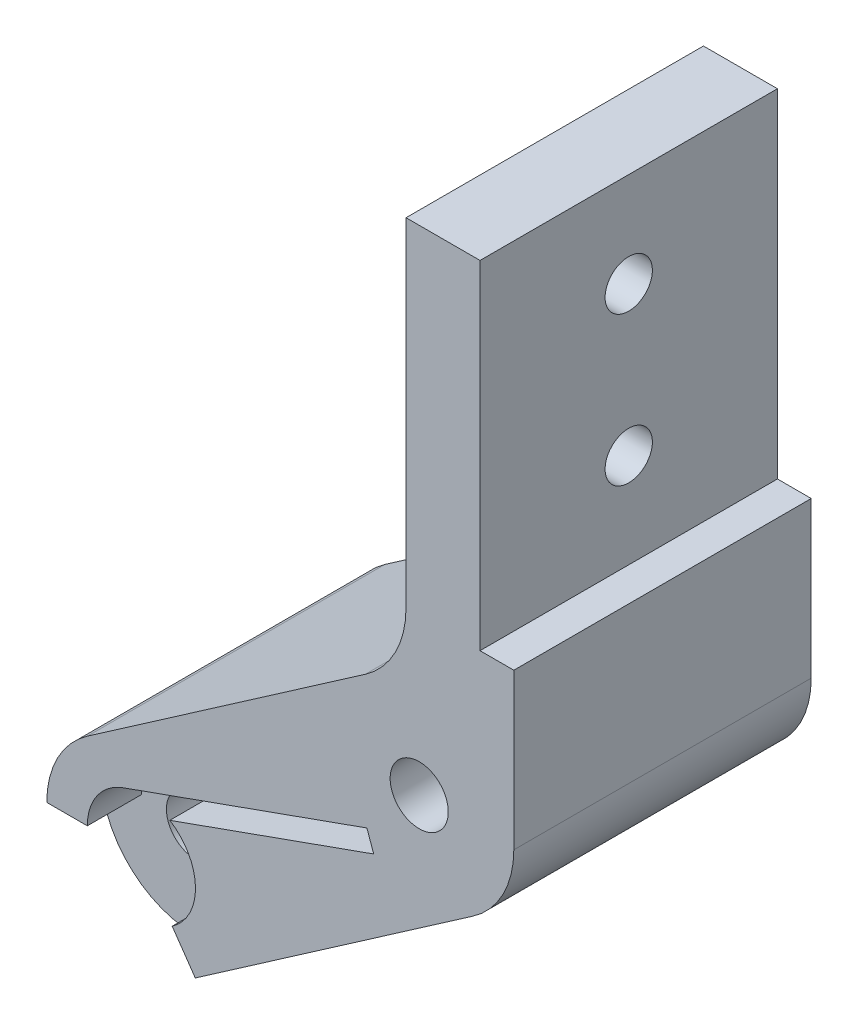
ISO-10303-21;
HEADER;
FILE_DESCRIPTION(('STEP AP214'),'2;1');
FILE_NAME('part.step','',(''),(''),'','','');
FILE_SCHEMA(('AUTOMOTIVE_DESIGN { 1 0 10303 214 1 1 1 1 }'));
ENDSEC;
DATA;
#1=APPLICATION_CONTEXT('core data for automotive mechanical design processes');
#2=APPLICATION_PROTOCOL_DEFINITION('international standard','automotive_design',2000,#1);
#3=PRODUCT_CONTEXT('',#1,'mechanical');
#4=PRODUCT('Part','Part','',(#3));
#5=PRODUCT_RELATED_PRODUCT_CATEGORY('part','',(#4));
#6=PRODUCT_DEFINITION_FORMATION('','',#4);
#7=PRODUCT_DEFINITION_CONTEXT('part definition',#1,'design');
#8=PRODUCT_DEFINITION('design','',#6,#7);
#9=PRODUCT_DEFINITION_SHAPE('','',#8);
#10=(LENGTH_UNIT() NAMED_UNIT(*) SI_UNIT(.MILLI.,.METRE.));
#11=(NAMED_UNIT(*) PLANE_ANGLE_UNIT() SI_UNIT($,.RADIAN.));
#12=(NAMED_UNIT(*) SI_UNIT($,.STERADIAN.) SOLID_ANGLE_UNIT());
#13=UNCERTAINTY_MEASURE_WITH_UNIT(LENGTH_MEASURE(1.E-05),#10,'distance_accuracy_value','');
#14=(GEOMETRIC_REPRESENTATION_CONTEXT(3) GLOBAL_UNCERTAINTY_ASSIGNED_CONTEXT((#13)) GLOBAL_UNIT_ASSIGNED_CONTEXT((#10,
#11,#12)) REPRESENTATION_CONTEXT('',''));
#15=CARTESIAN_POINT('',(0.,0.,0.));
#16=DIRECTION('',(0.,0.,1.));
#17=DIRECTION('',(1.,0.,0.));
#18=AXIS2_PLACEMENT_3D('',#15,#16,#17);
#19=CARTESIAN_POINT('',(11.878198097342,-9.51961429424794,9.00000000000001));
#20=DIRECTION('',(-0.941780242902148,-0.336229050022706,0.));
#21=DIRECTION('',(0.336229050022706,-0.941780242902148,0.));
#22=AXIS2_PLACEMENT_3D('',#19,#20,#21);
#23=PLANE('',#22);
#24=DIRECTION('',(-0.336229050022698,0.941780242902151,0.));
#25=VECTOR('',#24,1.);
#26=CARTESIAN_POINT('',(11.878198097342,-9.51961429424794,9.00000000000001));
#27=LINE('',#26,#25);
#28=CARTESIAN_POINT('',(11.878198097342,-9.51961429424794,9.00000000000001));
#29=VERTEX_POINT('',#28);
#30=CARTESIAN_POINT('',(11.3738545223079,-8.10694392989472,9.00000000000001));
#31=VERTEX_POINT('',#30);
#32=EDGE_CURVE('E273',#29,#31,#27,.T.);
#33=ORIENTED_EDGE('',*,*,#32,.F.);
#34=DIRECTION('',(0.,0.,1.));
#35=VECTOR('',#34,1.);
#36=CARTESIAN_POINT('',(11.878198097342,-9.51961429424794,7.));
#37=LINE('',#36,#35);
#38=CARTESIAN_POINT('',(11.878198097342,-9.51961429424794,11.));
#39=VERTEX_POINT('',#38);
#40=EDGE_CURVE('E263',#29,#39,#37,.T.);
#41=ORIENTED_EDGE('',*,*,#40,.T.);
#42=DIRECTION('',(0.336229050022706,-0.941780242902148,0.));
#43=VECTOR('',#42,1.);
#44=CARTESIAN_POINT('',(11.878198097342,-9.51961429424794,11.));
#45=LINE('',#44,#43);
#46=CARTESIAN_POINT('',(11.3738545223079,-8.10694392989472,11.));
#47=VERTEX_POINT('',#46);
#48=EDGE_CURVE('E274',#39,#47,#45,.F.);
#49=ORIENTED_EDGE('',*,*,#48,.T.);
#50=DIRECTION('',(0.,0.,1.));
#51=VECTOR('',#50,1.);
#52=CARTESIAN_POINT('',(11.3738545223079,-8.10694392989472,7.));
#53=LINE('',#52,#51);
#54=EDGE_CURVE('E178',#31,#47,#53,.T.);
#55=ORIENTED_EDGE('',*,*,#54,.F.);
#56=EDGE_LOOP('',(#33,#41,#49,#55));
#57=FACE_BOUND('',#56,.T.);
#58=ADVANCED_FACE('F16',(#57),#23,.T.);
#59=CARTESIAN_POINT('',(12.2298465567236,4.3662305730891,7.));
#60=DIRECTION('',(0.941780242902148,0.336229050022707,0.));
#61=DIRECTION('',(-0.336229050022707,0.941780242902148,0.));
#62=AXIS2_PLACEMENT_3D('',#59,#60,#61);
#63=PLANE('',#62);
#64=DIRECTION('',(0.33622905002271,-0.941780242902147,0.));
#65=VECTOR('',#64,1.);
#66=CARTESIAN_POINT('',(16.0827557368186,-6.4257986797812,9.00000000000001));
#67=LINE('',#66,#65);
#68=CARTESIAN_POINT('',(16.0827557368186,-6.4257986797812,9.00000000000001));
#69=VERTEX_POINT('',#68);
#70=CARTESIAN_POINT('',(16.5870993118527,-7.83846904413441,9.00000000000001));
#71=VERTEX_POINT('',#70);
#72=EDGE_CURVE('E251',#69,#71,#67,.T.);
#73=ORIENTED_EDGE('',*,*,#72,.F.);
#74=DIRECTION('',(0.,0.,1.));
#75=VECTOR('',#74,1.);
#76=CARTESIAN_POINT('',(16.0827557368186,-6.4257986797812,7.));
#77=LINE('',#76,#75);
#78=CARTESIAN_POINT('',(16.0827557368186,-6.4257986797812,7.));
#79=VERTEX_POINT('',#78);
#80=EDGE_CURVE('E243',#79,#69,#77,.T.);
#81=ORIENTED_EDGE('',*,*,#80,.F.);
#82=DIRECTION('',(-0.336229050022707,0.941780242902148,0.));
#83=VECTOR('',#82,1.);
#84=CARTESIAN_POINT('',(12.2298465567236,4.3662305730891,7.));
#85=LINE('',#84,#83);
#86=CARTESIAN_POINT('',(16.5870993118527,-7.83846904413441,7.));
#87=VERTEX_POINT('',#86);
#88=EDGE_CURVE('E271',#87,#79,#85,.T.);
#89=ORIENTED_EDGE('',*,*,#88,.F.);
#90=DIRECTION('',(0.,0.,1.));
#91=VECTOR('',#90,1.);
#92=CARTESIAN_POINT('',(16.5870993118527,-7.83846904413441,7.));
#93=LINE('',#92,#91);
#94=EDGE_CURVE('E250',#87,#71,#93,.T.);
#95=ORIENTED_EDGE('',*,*,#94,.T.);
#96=EDGE_LOOP('',(#73,#81,#89,#95));
#97=FACE_BOUND('',#96,.T.);
#98=ADVANCED_FACE('F540',(#97),#63,.F.);
#99=CARTESIAN_POINT('',(0.,0.,9.00000000000001));
#100=DIRECTION('',(0.,0.,-1.));
#101=DIRECTION('',(-1.,0.,0.));
#102=AXIS2_PLACEMENT_3D('',#99,#100,#101);
#103=PLANE('',#102);
#104=DIRECTION('',(0.941780242902148,0.336229050022705,0.));
#105=VECTOR('',#104,1.);
#106=CARTESIAN_POINT('',(3.85290918009504,-10.7920292528703,9.00000000000001));
#107=LINE('',#106,#105);
#108=EDGE_CURVE('E164',#69,#31,#107,.F.);
#109=ORIENTED_EDGE('',*,*,#108,.F.);
#110=ORIENTED_EDGE('',*,*,#72,.T.);
#111=DIRECTION('',(0.941780242902148,0.336229050022705,0.));
#112=VECTOR('',#111,1.);
#113=CARTESIAN_POINT('',(4.3572527551291,-12.2046996172235,9.00000000000001));
#114=LINE('',#113,#112);
#115=EDGE_CURVE('E254',#71,#29,#114,.F.);
#116=ORIENTED_EDGE('',*,*,#115,.T.);
#117=ORIENTED_EDGE('',*,*,#32,.T.);
#118=EDGE_LOOP('',(#109,#110,#116,#117));
#119=FACE_BOUND('',#118,.T.);
#120=ADVANCED_FACE('F545',(#119),#103,.T.);
#121=CARTESIAN_POINT('',(17.2687836787583,25.4362538271655,0.));
#122=DIRECTION('',(-1.,0.,0.));
#123=DIRECTION('',(0.,-1.,0.));
#124=AXIS2_PLACEMENT_3D('',#121,#122,#123);
#125=PLANE('',#124);
#126=CARTESIAN_POINT('',(17.2687836787583,25.4362538271655,0.));
#127=DIRECTION('',(-1.,0.,0.));
#128=DIRECTION('',(0.,-1.,0.));
#129=AXIS2_PLACEMENT_3D('',#126,#127,#128);
#130=CIRCLE('',#129,3.);
#131=CARTESIAN_POINT('',(17.2687836787583,22.4362538271655,0.));
#132=VERTEX_POINT('',#131);
#133=EDGE_CURVE('E19',#132,#132,#130,.T.);
#134=ORIENTED_EDGE('',*,*,#133,.T.);
#135=EDGE_LOOP('',(#134));
#136=FACE_BOUND('',#135,.T.);
#137=CARTESIAN_POINT('',(17.2687836787583,25.4362538271655,0.));
#138=DIRECTION('',(-1.,0.,0.));
#139=DIRECTION('',(0.,-1.,0.));
#140=AXIS2_PLACEMENT_3D('',#137,#138,#139);
#141=CIRCLE('',#140,1.75);
#142=CARTESIAN_POINT('',(17.2687836787583,23.6862538271655,0.));
#143=VERTEX_POINT('',#142);
#144=EDGE_CURVE('E260',#143,#143,#141,.F.);
#145=ORIENTED_EDGE('',*,*,#144,.T.);
#146=EDGE_LOOP('',(#145));
#147=FACE_BOUND('',#146,.T.);
#148=ADVANCED_FACE('F349',(#136,#147),#125,.T.);
#149=CARTESIAN_POINT('',(17.2687836787583,14.4362538271655,0.));
#150=DIRECTION('',(-1.,0.,0.));
#151=DIRECTION('',(0.,-1.,0.));
#152=AXIS2_PLACEMENT_3D('',#149,#150,#151);
#153=PLANE('',#152);
#154=CARTESIAN_POINT('',(17.2687836787583,14.4362538271655,0.));
#155=DIRECTION('',(-1.,0.,0.));
#156=DIRECTION('',(0.,-1.,0.));
#157=AXIS2_PLACEMENT_3D('',#154,#155,#156);
#158=CIRCLE('',#157,3.);
#159=CARTESIAN_POINT('',(17.2687836787583,11.4362538271655,0.));
#160=VERTEX_POINT('',#159);
#161=EDGE_CURVE('E262',#160,#160,#158,.T.);
#162=ORIENTED_EDGE('',*,*,#161,.T.);
#163=EDGE_LOOP('',(#162));
#164=FACE_BOUND('',#163,.T.);
#165=CARTESIAN_POINT('',(17.2687836787583,14.4362538271655,0.));
#166=DIRECTION('',(-1.,0.,0.));
#167=DIRECTION('',(0.,-1.,0.));
#168=AXIS2_PLACEMENT_3D('',#165,#166,#167);
#169=CIRCLE('',#168,1.75);
#170=CARTESIAN_POINT('',(17.2687836787583,12.6862538271655,0.));
#171=VERTEX_POINT('',#170);
#172=EDGE_CURVE('E190',#171,#171,#169,.F.);
#173=ORIENTED_EDGE('',*,*,#172,.T.);
#174=EDGE_LOOP('',(#173));
#175=FACE_BOUND('',#174,.T.);
#176=ADVANCED_FACE('F552',(#164,#175),#153,.T.);
#177=CARTESIAN_POINT('',(-5.30710599482682,-18.3095613457506,7.));
#178=DIRECTION('',(0.,0.,1.));
#179=DIRECTION('',(1.,0.,0.));
#180=AXIS2_PLACEMENT_3D('',#177,#178,#179);
#181=CYLINDRICAL_SURFACE('',#180,4.);
#182=CARTESIAN_POINT('',(-5.30710599482682,-18.3095613457506,7.));
#183=DIRECTION('',(0.,0.,1.));
#184=DIRECTION('',(1.,0.,0.));
#185=AXIS2_PLACEMENT_3D('',#182,#183,#184);
#186=CIRCLE('',#185,4.);
#187=CARTESIAN_POINT('',(-3.02899187111085,-21.5974476028048,7.));
#188=VERTEX_POINT('',#187);
#189=CARTESIAN_POINT('',(-3.20697075395605,-14.9052358662977,7.));
#190=VERTEX_POINT('',#189);
#191=EDGE_CURVE('E334',#188,#190,#186,.T.);
#192=ORIENTED_EDGE('',*,*,#191,.F.);
#193=DIRECTION('',(0.,0.,1.));
#194=VECTOR('',#193,1.);
#195=CARTESIAN_POINT('',(-3.02899187111085,-21.5974476028048,7.));
#196=LINE('',#195,#194);
#197=CARTESIAN_POINT('',(-3.02899187111085,-21.5974476028048,11.));
#198=VERTEX_POINT('',#197);
#199=EDGE_CURVE('E257',#188,#198,#196,.T.);
#200=ORIENTED_EDGE('',*,*,#199,.T.);
#201=CARTESIAN_POINT('',(-5.30710599482682,-18.3095613457506,11.));
#202=DIRECTION('',(0.,0.,1.));
#203=DIRECTION('',(1.,0.,0.));
#204=AXIS2_PLACEMENT_3D('',#201,#202,#203);
#205=CIRCLE('',#204,4.);
#206=CARTESIAN_POINT('',(-3.20697075395605,-14.9052358662977,11.));
#207=VERTEX_POINT('',#206);
#208=EDGE_CURVE('E182',#207,#198,#205,.F.);
#209=ORIENTED_EDGE('',*,*,#208,.F.);
#210=DIRECTION('',(0.,0.,1.));
#211=VECTOR('',#210,1.);
#212=CARTESIAN_POINT('',(-3.20697075395605,-14.9052358662977,7.));
#213=LINE('',#212,#211);
#214=EDGE_CURVE('E247',#207,#190,#213,.F.);
#215=ORIENTED_EDGE('',*,*,#214,.T.);
#216=EDGE_LOOP('',(#192,#200,#209,#215));
#217=FACE_BOUND('',#216,.T.);
#218=ADVANCED_FACE('F531',(#217),#181,.F.);
#219=CARTESIAN_POINT('',(4.3572527551291,-12.2046996172235,7.));
#220=DIRECTION('',(0.336229050022705,-0.941780242902148,0.));
#221=DIRECTION('',(0.941780242902148,0.336229050022705,0.));
#222=AXIS2_PLACEMENT_3D('',#219,#220,#221);
#223=PLANE('',#222);
#224=ORIENTED_EDGE('',*,*,#40,.F.);
#225=ORIENTED_EDGE('',*,*,#115,.F.);
#226=ORIENTED_EDGE('',*,*,#94,.F.);
#227=DIRECTION('',(0.941780242902148,0.336229050022705,0.));
#228=VECTOR('',#227,1.);
#229=CARTESIAN_POINT('',(-3.20697075395605,-14.9052358662977,7.));
#230=LINE('',#229,#228);
#231=EDGE_CURVE('E336',#190,#87,#230,.T.);
#232=ORIENTED_EDGE('',*,*,#231,.F.);
#233=ORIENTED_EDGE('',*,*,#214,.F.);
#234=DIRECTION('',(-0.941780242902148,-0.336229050022705,0.));
#235=VECTOR('',#234,1.);
#236=CARTESIAN_POINT('',(11.8781980973419,-9.51961429424794,11.));
#237=LINE('',#236,#235);
#238=EDGE_CURVE('E179',#39,#207,#237,.T.);
#239=ORIENTED_EDGE('',*,*,#238,.F.);
#240=EDGE_LOOP('',(#224,#225,#226,#232,#233,#239));
#241=FACE_BOUND('',#240,.T.);
#242=ADVANCED_FACE('F536',(#241),#223,.F.);
#243=CARTESIAN_POINT('',(3.85290918009504,-10.7920292528703,7.));
#244=DIRECTION('',(0.336229050022705,-0.941780242902148,0.));
#245=DIRECTION('',(0.941780242902148,0.336229050022705,0.));
#246=AXIS2_PLACEMENT_3D('',#243,#244,#245);
#247=PLANE('',#246);
#248=ORIENTED_EDGE('',*,*,#80,.T.);
#249=ORIENTED_EDGE('',*,*,#108,.T.);
#250=ORIENTED_EDGE('',*,*,#54,.T.);
#251=DIRECTION('',(0.941780242902148,0.336229050022705,0.));
#252=VECTOR('',#251,1.);
#253=CARTESIAN_POINT('',(-6.65202219491764,-14.542440374142,11.));
#254=LINE('',#253,#252);
#255=CARTESIAN_POINT('',(-6.65202219491764,-14.542440374142,11.));
#256=VERTEX_POINT('',#255);
#257=EDGE_CURVE('E170',#256,#47,#254,.T.);
#258=ORIENTED_EDGE('',*,*,#257,.F.);
#259=DIRECTION('',(0.,0.,1.));
#260=VECTOR('',#259,1.);
#261=CARTESIAN_POINT('',(-6.65202219491764,-14.542440374142,7.));
#262=LINE('',#261,#260);
#263=CARTESIAN_POINT('',(-6.65202219491764,-14.542440374142,7.));
#264=VERTEX_POINT('',#263);
#265=EDGE_CURVE('E155',#256,#264,#262,.F.);
#266=ORIENTED_EDGE('',*,*,#265,.T.);
#267=DIRECTION('',(-0.941780242902148,-0.336229050022705,0.));
#268=VECTOR('',#267,1.);
#269=CARTESIAN_POINT('',(16.0827557368186,-6.4257986797812,7.));
#270=LINE('',#269,#268);
#271=EDGE_CURVE('E333',#79,#264,#270,.T.);
#272=ORIENTED_EDGE('',*,*,#271,.F.);
#273=EDGE_LOOP('',(#248,#249,#250,#258,#266,#272));
#274=FACE_BOUND('',#273,.T.);
#275=ADVANCED_FACE('F175',(#274),#247,.T.);
#276=CARTESIAN_POINT('',(-5.30710599482682,-18.3095613457506,7.));
#277=DIRECTION('',(0.,0.,1.));
#278=DIRECTION('',(1.,0.,0.));
#279=AXIS2_PLACEMENT_3D('',#276,#277,#278);
#280=CYLINDRICAL_SURFACE('',#279,4.);
#281=CARTESIAN_POINT('',(-5.30710599482682,-18.3095613457506,11.));
#282=DIRECTION('',(0.,0.,1.));
#283=DIRECTION('',(1.,0.,0.));
#284=AXIS2_PLACEMENT_3D('',#281,#282,#283);
#285=CIRCLE('',#284,4.);
#286=CARTESIAN_POINT('',(-9.30710599482682,-18.3095613457506,11.));
#287=VERTEX_POINT('',#286);
#288=EDGE_CURVE('E158',#287,#256,#285,.F.);
#289=ORIENTED_EDGE('',*,*,#288,.F.);
#290=DIRECTION('',(0.,0.,-1.));
#291=VECTOR('',#290,1.);
#292=CARTESIAN_POINT('',(-9.30710599482682,-18.3095613457506,7.));
#293=LINE('',#292,#291);
#294=CARTESIAN_POINT('',(-9.30710599482682,-18.3095613457506,7.));
#295=VERTEX_POINT('',#294);
#296=EDGE_CURVE('E148',#295,#287,#293,.F.);
#297=ORIENTED_EDGE('',*,*,#296,.F.);
#298=CARTESIAN_POINT('',(-5.30710599482682,-18.3095613457506,7.));
#299=DIRECTION('',(0.,0.,1.));
#300=DIRECTION('',(1.,0.,0.));
#301=AXIS2_PLACEMENT_3D('',#298,#299,#300);
#302=CIRCLE('',#301,4.);
#303=EDGE_CURVE('E160',#264,#295,#302,.T.);
#304=ORIENTED_EDGE('',*,*,#303,.F.);
#305=ORIENTED_EDGE('',*,*,#265,.F.);
#306=EDGE_LOOP('',(#289,#297,#304,#305));
#307=FACE_BOUND('',#306,.T.);
#308=ADVANCED_FACE('F157',(#307),#280,.F.);
#309=CARTESIAN_POINT('',(17.2687836787583,25.4362538271655,0.));
#310=DIRECTION('',(-1.,0.,0.));
#311=DIRECTION('',(0.,-1.,0.));
#312=AXIS2_PLACEMENT_3D('',#309,#310,#311);
#313=CYLINDRICAL_SURFACE('',#312,3.);
#314=CARTESIAN_POINT('',(14.2687836787583,25.4362538271655,0.));
#315=DIRECTION('',(-1.,0.,0.));
#316=DIRECTION('',(0.,-1.,0.));
#317=AXIS2_PLACEMENT_3D('',#314,#315,#316);
#318=CIRCLE('',#317,3.);
#319=CARTESIAN_POINT('',(14.2687836787583,22.4362538271655,0.));
#320=VERTEX_POINT('',#319);
#321=EDGE_CURVE('E326',#320,#320,#318,.F.);
#322=ORIENTED_EDGE('',*,*,#321,.F.);
#323=EDGE_LOOP('',(#322));
#324=FACE_BOUND('',#323,.T.);
#325=ORIENTED_EDGE('',*,*,#133,.F.);
#326=EDGE_LOOP('',(#325));
#327=FACE_BOUND('',#326,.T.);
#328=ADVANCED_FACE('F352',(#324,#327),#313,.F.);
#329=CARTESIAN_POINT('',(17.2687836787583,14.4362538271655,0.));
#330=DIRECTION('',(-1.,0.,0.));
#331=DIRECTION('',(0.,-1.,0.));
#332=AXIS2_PLACEMENT_3D('',#329,#330,#331);
#333=CYLINDRICAL_SURFACE('',#332,3.);
#334=CARTESIAN_POINT('',(14.2687836787583,14.4362538271655,0.));
#335=DIRECTION('',(-1.,0.,0.));
#336=DIRECTION('',(0.,-1.,0.));
#337=AXIS2_PLACEMENT_3D('',#334,#335,#336);
#338=CIRCLE('',#337,3.);
#339=CARTESIAN_POINT('',(14.2687836787583,11.4362538271655,0.));
#340=VERTEX_POINT('',#339);
#341=EDGE_CURVE('E194',#340,#340,#338,.F.);
#342=ORIENTED_EDGE('',*,*,#341,.F.);
#343=EDGE_LOOP('',(#342));
#344=FACE_BOUND('',#343,.T.);
#345=ORIENTED_EDGE('',*,*,#161,.F.);
#346=EDGE_LOOP('',(#345));
#347=FACE_BOUND('',#346,.T.);
#348=ADVANCED_FACE('F354',(#344,#347),#333,.F.);
#349=CARTESIAN_POINT('',(0.,-18.3095613457506,7.));
#350=DIRECTION('',(0.,-1.,0.));
#351=DIRECTION('',(0.,0.,-1.));
#352=AXIS2_PLACEMENT_3D('',#349,#350,#351);
#353=PLANE('',#352);
#354=DIRECTION('',(1.,0.,0.));
#355=VECTOR('',#354,1.);
#356=CARTESIAN_POINT('',(0.,-18.3095613457506,7.));
#357=LINE('',#356,#355);
#358=CARTESIAN_POINT('',(-12.3071059948268,-18.3095613457506,7.));
#359=VERTEX_POINT('',#358);
#360=EDGE_CURVE('E446',#295,#359,#357,.F.);
#361=ORIENTED_EDGE('',*,*,#360,.F.);
#362=ORIENTED_EDGE('',*,*,#296,.T.);
#363=DIRECTION('',(1.,0.,0.));
#364=VECTOR('',#363,1.);
#365=CARTESIAN_POINT('',(0.,-18.3095613457506,11.));
#366=LINE('',#365,#364);
#367=CARTESIAN_POINT('',(-12.3071059948268,-18.3095613457506,11.));
#368=VERTEX_POINT('',#367);
#369=EDGE_CURVE('E172',#368,#287,#366,.T.);
#370=ORIENTED_EDGE('',*,*,#369,.F.);
#371=DIRECTION('',(0.,0.,-1.));
#372=VECTOR('',#371,1.);
#373=CARTESIAN_POINT('',(-12.3071059948268,-18.3095613457506,11.));
#374=LINE('',#373,#372);
#375=EDGE_CURVE('E236',#359,#368,#374,.F.);
#376=ORIENTED_EDGE('',*,*,#375,.F.);
#377=EDGE_LOOP('',(#361,#362,#370,#376));
#378=FACE_BOUND('',#377,.T.);
#379=ADVANCED_FACE('F362',(#378),#353,.T.);
#380=CARTESIAN_POINT('',(-12.1570480369892,-8.42338836276296,7.));
#381=DIRECTION('',(0.821971564263548,0.569528530928992,0.));
#382=DIRECTION('',(-0.569528530928992,0.821971564263548,0.));
#383=AXIS2_PLACEMENT_3D('',#380,#381,#382);
#384=PLANE('',#383);
#385=ORIENTED_EDGE('',*,*,#199,.F.);
#386=DIRECTION('',(-0.569528530928992,0.821971564263548,0.));
#387=VECTOR('',#386,1.);
#388=CARTESIAN_POINT('',(-1.32040627832387,-24.0633622955955,7.));
#389=LINE('',#388,#387);
#390=CARTESIAN_POINT('',(-1.32040627832387,-24.0633622955955,7.));
#391=VERTEX_POINT('',#390);
#392=EDGE_CURVE('E337',#391,#188,#389,.T.);
#393=ORIENTED_EDGE('',*,*,#392,.F.);
#394=DIRECTION('',(0.,0.,1.));
#395=VECTOR('',#394,1.);
#396=CARTESIAN_POINT('',(-1.32040627832387,-24.0633622955955,11.));
#397=LINE('',#396,#395);
#398=CARTESIAN_POINT('',(-1.32040627832387,-24.0633622955955,11.));
#399=VERTEX_POINT('',#398);
#400=EDGE_CURVE('E228',#391,#399,#397,.T.);
#401=ORIENTED_EDGE('',*,*,#400,.T.);
#402=DIRECTION('',(0.569528530928993,-0.821971564263548,0.));
#403=VECTOR('',#402,1.);
#404=CARTESIAN_POINT('',(-3.02899187111085,-21.5974476028048,11.));
#405=LINE('',#404,#403);
#406=EDGE_CURVE('E338',#198,#399,#405,.T.);
#407=ORIENTED_EDGE('',*,*,#406,.F.);
#408=EDGE_LOOP('',(#385,#393,#401,#407));
#409=FACE_BOUND('',#408,.T.);
#410=ADVANCED_FACE('F437',(#409),#384,.F.);
#411=CARTESIAN_POINT('',(24.2687836787583,25.4362538271655,0.));
#412=DIRECTION('',(-1.,0.,0.));
#413=DIRECTION('',(0.,-1.,0.));
#414=AXIS2_PLACEMENT_3D('',#411,#412,#413);
#415=CYLINDRICAL_SURFACE('',#414,1.75);
#416=ORIENTED_EDGE('',*,*,#144,.F.);
#417=EDGE_LOOP('',(#416));
#418=FACE_BOUND('',#417,.T.);
#419=CARTESIAN_POINT('',(19.7421831117619,25.4362538271655,0.));
#420=DIRECTION('',(-1.,0.,0.));
#421=DIRECTION('',(0.,-1.,0.));
#422=AXIS2_PLACEMENT_3D('',#419,#420,#421);
#423=CIRCLE('',#422,1.75);
#424=CARTESIAN_POINT('',(19.7421831117619,23.6862538271655,0.));
#425=VERTEX_POINT('',#424);
#426=EDGE_CURVE('E221',#425,#425,#423,.F.);
#427=ORIENTED_EDGE('',*,*,#426,.T.);
#428=EDGE_LOOP('',(#427));
#429=FACE_BOUND('',#428,.T.);
#430=ADVANCED_FACE('F433',(#418,#429),#415,.F.);
#431=CARTESIAN_POINT('',(24.2687836787583,14.4362538271655,0.));
#432=DIRECTION('',(-1.,0.,0.));
#433=DIRECTION('',(0.,-1.,0.));
#434=AXIS2_PLACEMENT_3D('',#431,#432,#433);
#435=CYLINDRICAL_SURFACE('',#434,1.75);
#436=ORIENTED_EDGE('',*,*,#172,.F.);
#437=EDGE_LOOP('',(#436));
#438=FACE_BOUND('',#437,.T.);
#439=CARTESIAN_POINT('',(19.7421831117619,14.4362538271655,0.));
#440=DIRECTION('',(-1.,0.,0.));
#441=DIRECTION('',(0.,-1.,0.));
#442=AXIS2_PLACEMENT_3D('',#439,#440,#441);
#443=CIRCLE('',#442,1.75);
#444=CARTESIAN_POINT('',(19.7421831117619,12.6862538271655,0.));
#445=VERTEX_POINT('',#444);
#446=EDGE_CURVE('E215',#445,#445,#443,.F.);
#447=ORIENTED_EDGE('',*,*,#446,.T.);
#448=EDGE_LOOP('',(#447));
#449=FACE_BOUND('',#448,.T.);
#450=ADVANCED_FACE('F429',(#438,#449),#435,.F.);
#451=CARTESIAN_POINT('',(0.,0.,11.));
#452=DIRECTION('',(0.,0.,1.));
#453=DIRECTION('',(1.,0.,0.));
#454=AXIS2_PLACEMENT_3D('',#451,#452,#453);
#455=PLANE('',#454);
#456=CARTESIAN_POINT('',(15.2421831117619,-4.07134807252582,11.));
#457=DIRECTION('',(0.,0.,-1.));
#458=DIRECTION('',(-1.,0.,0.));
#459=AXIS2_PLACEMENT_3D('',#456,#457,#458);
#460=CIRCLE('',#459,2.15);
#461=CARTESIAN_POINT('',(13.0921831117619,-4.07134807252582,11.));
#462=VERTEX_POINT('',#461);
#463=EDGE_CURVE('E329',#462,#462,#460,.T.);
#464=ORIENTED_EDGE('',*,*,#463,.T.);
#465=EDGE_LOOP('',(#464));
#466=FACE_BOUND('',#465,.T.);
#467=DIRECTION('',(0.,1.,0.));
#468=VECTOR('',#467,1.);
#469=CARTESIAN_POINT('',(22.2421831117619,0.,11.));
#470=LINE('',#469,#468);
#471=CARTESIAN_POINT('',(22.2421831117619,-4.07134807252582,11.));
#472=VERTEX_POINT('',#471);
#473=CARTESIAN_POINT('',(22.2421831117619,7.43625382716546,11.));
#474=VERTEX_POINT('',#473);
#475=EDGE_CURVE('E203',#472,#474,#470,.T.);
#476=ORIENTED_EDGE('',*,*,#475,.T.);
#477=DIRECTION('',(1.,0.,0.));
#478=VECTOR('',#477,1.);
#479=CARTESIAN_POINT('',(0.,7.43625382716546,11.));
#480=LINE('',#479,#478);
#481=CARTESIAN_POINT('',(19.7421831117619,7.43625382716546,11.));
#482=VERTEX_POINT('',#481);
#483=EDGE_CURVE('E205',#482,#474,#480,.T.);
#484=ORIENTED_EDGE('',*,*,#483,.F.);
#485=DIRECTION('',(0.,1.,0.));
#486=VECTOR('',#485,1.);
#487=CARTESIAN_POINT('',(19.7421831117619,7.43625382716546,11.));
#488=LINE('',#487,#486);
#489=CARTESIAN_POINT('',(19.7421831117619,32.4362538271655,11.));
#490=VERTEX_POINT('',#489);
#491=EDGE_CURVE('E213',#482,#490,#488,.T.);
#492=ORIENTED_EDGE('',*,*,#491,.T.);
#493=DIRECTION('',(1.,0.,0.));
#494=VECTOR('',#493,1.);
#495=CARTESIAN_POINT('',(0.,32.4362538271655,11.));
#496=LINE('',#495,#494);
#497=CARTESIAN_POINT('',(14.2687836787583,32.4362538271655,11.));
#498=VERTEX_POINT('',#497);
#499=EDGE_CURVE('E197',#490,#498,#496,.F.);
#500=ORIENTED_EDGE('',*,*,#499,.T.);
#501=DIRECTION('',(0.,-1.,0.));
#502=VECTOR('',#501,1.);
#503=CARTESIAN_POINT('',(14.2687836787583,0.,11.));
#504=LINE('',#503,#502);
#505=CARTESIAN_POINT('',(14.2687836787583,7.43625382716546,11.));
#506=VERTEX_POINT('',#505);
#507=EDGE_CURVE('E191',#506,#498,#504,.F.);
#508=ORIENTED_EDGE('',*,*,#507,.F.);
#509=CARTESIAN_POINT('',(7.26878367875835,7.43625382716546,11.));
#510=DIRECTION('',(0.,0.,-1.));
#511=DIRECTION('',(-1.,0.,0.));
#512=AXIS2_PLACEMENT_3D('',#509,#510,#511);
#513=CIRCLE('',#512,6.99999999999998);
#514=CARTESIAN_POINT('',(11.2554833952601,1.68245287731983,11.));
#515=VERTEX_POINT('',#514);
#516=EDGE_CURVE('E241',#506,#515,#513,.T.);
#517=ORIENTED_EDGE('',*,*,#516,.T.);
#518=DIRECTION('',(-0.821971564263548,-0.569528530928992,0.));
#519=VECTOR('',#518,1.);
#520=CARTESIAN_POINT('',(2.86324232565943,-4.13237203314282,11.));
#521=LINE('',#520,#519);
#522=CARTESIAN_POINT('',(-9.29380571132976,-12.5557603959058,11.));
#523=VERTEX_POINT('',#522);
#524=EDGE_CURVE('E240',#523,#515,#521,.F.);
#525=ORIENTED_EDGE('',*,*,#524,.F.);
#526=CARTESIAN_POINT('',(-5.30710599482682,-18.3095613457506,11.));
#527=DIRECTION('',(0.,0.,-1.));
#528=DIRECTION('',(-1.,0.,0.));
#529=AXIS2_PLACEMENT_3D('',#526,#527,#528);
#530=CIRCLE('',#529,7.);
#531=EDGE_CURVE('E238',#368,#523,#530,.T.);
#532=ORIENTED_EDGE('',*,*,#531,.F.);
#533=ORIENTED_EDGE('',*,*,#369,.T.);
#534=ORIENTED_EDGE('',*,*,#288,.T.);
#535=ORIENTED_EDGE('',*,*,#257,.T.);
#536=ORIENTED_EDGE('',*,*,#48,.F.);
#537=ORIENTED_EDGE('',*,*,#238,.T.);
#538=ORIENTED_EDGE('',*,*,#208,.T.);
#539=ORIENTED_EDGE('',*,*,#406,.T.);
#540=DIRECTION('',(-0.821971564263548,-0.569528530928992,0.));
#541=VECTOR('',#540,1.);
#542=CARTESIAN_POINT('',(10.8366417586653,-15.6399739328325,11.));
#543=LINE('',#542,#541);
#544=CARTESIAN_POINT('',(19.2288828282648,-9.82514902237066,11.));
#545=VERTEX_POINT('',#544);
#546=EDGE_CURVE('E224',#399,#545,#543,.F.);
#547=ORIENTED_EDGE('',*,*,#546,.T.);
#548=CARTESIAN_POINT('',(15.2421831117619,-4.07134807252582,11.));
#549=DIRECTION('',(0.,0.,-1.));
#550=DIRECTION('',(-1.,0.,0.));
#551=AXIS2_PLACEMENT_3D('',#548,#549,#550);
#552=CIRCLE('',#551,7.);
#553=EDGE_CURVE('E227',#472,#545,#552,.T.);
#554=ORIENTED_EDGE('',*,*,#553,.F.);
#555=EDGE_LOOP('',(#476,#484,#492,#500,#508,#517,#525,#532,#533,#534,#535,#536,#537,#538,#539,
#547,#554));
#556=FACE_BOUND('',#555,.T.);
#557=ADVANCED_FACE('F169',(#466,#556),#455,.T.);
#558=CARTESIAN_POINT('',(0.,0.,7.));
#559=DIRECTION('',(0.,0.,1.));
#560=DIRECTION('',(1.,0.,0.));
#561=AXIS2_PLACEMENT_3D('',#558,#559,#560);
#562=PLANE('',#561);
#563=CARTESIAN_POINT('',(-5.30710599482682,-18.3095613457506,7.));
#564=DIRECTION('',(0.,0.,-1.));
#565=DIRECTION('',(-1.,0.,0.));
#566=AXIS2_PLACEMENT_3D('',#563,#564,#565);
#567=CIRCLE('',#566,2.15);
#568=CARTESIAN_POINT('',(-7.45710599482682,-18.3095613457506,7.));
#569=VERTEX_POINT('',#568);
#570=EDGE_CURVE('E200',#569,#569,#567,.T.);
#571=ORIENTED_EDGE('',*,*,#570,.T.);
#572=EDGE_LOOP('',(#571));
#573=FACE_BOUND('',#572,.T.);
#574=ORIENTED_EDGE('',*,*,#271,.T.);
#575=ORIENTED_EDGE('',*,*,#303,.T.);
#576=ORIENTED_EDGE('',*,*,#360,.T.);
#577=CARTESIAN_POINT('',(-5.30710599482682,-18.3095613457506,7.));
#578=DIRECTION('',(0.,0.,-1.));
#579=DIRECTION('',(-1.,0.,0.));
#580=AXIS2_PLACEMENT_3D('',#577,#578,#579);
#581=CIRCLE('',#580,7.);
#582=EDGE_CURVE('E317',#391,#359,#581,.T.);
#583=ORIENTED_EDGE('',*,*,#582,.F.);
#584=ORIENTED_EDGE('',*,*,#392,.T.);
#585=ORIENTED_EDGE('',*,*,#191,.T.);
#586=ORIENTED_EDGE('',*,*,#231,.T.);
#587=ORIENTED_EDGE('',*,*,#88,.T.);
#588=EDGE_LOOP('',(#574,#575,#576,#583,#584,#585,#586,#587));
#589=FACE_BOUND('',#588,.T.);
#590=ADVANCED_FACE('F422',(#573,#589),#562,.T.);
#591=CARTESIAN_POINT('',(15.2421831117619,-4.07134807252582,11.));
#592=DIRECTION('',(0.,0.,-1.));
#593=DIRECTION('',(-1.,0.,0.));
#594=AXIS2_PLACEMENT_3D('',#591,#592,#593);
#595=CYLINDRICAL_SURFACE('',#594,2.15);
#596=CARTESIAN_POINT('',(15.2421831117619,-4.07134807252582,-11.));
#597=DIRECTION('',(0.,0.,-1.));
#598=DIRECTION('',(-1.,0.,0.));
#599=AXIS2_PLACEMENT_3D('',#596,#597,#598);
#600=CIRCLE('',#599,2.15);
#601=CARTESIAN_POINT('',(13.0921831117619,-4.07134807252582,-11.));
#602=VERTEX_POINT('',#601);
#603=EDGE_CURVE('E305',#602,#602,#600,.T.);
#604=ORIENTED_EDGE('',*,*,#603,.T.);
#605=EDGE_LOOP('',(#604));
#606=FACE_BOUND('',#605,.T.);
#607=ORIENTED_EDGE('',*,*,#463,.F.);
#608=EDGE_LOOP('',(#607));
#609=FACE_BOUND('',#608,.T.);
#610=ADVANCED_FACE('F418',(#606,#609),#595,.F.);
#611=CARTESIAN_POINT('',(14.2687836787583,0.,11.));
#612=DIRECTION('',(-1.,0.,0.));
#613=DIRECTION('',(0.,-1.,0.));
#614=AXIS2_PLACEMENT_3D('',#611,#612,#613);
#615=PLANE('',#614);
#616=ORIENTED_EDGE('',*,*,#507,.T.);
#617=DIRECTION('',(0.,0.,-1.));
#618=VECTOR('',#617,1.);
#619=CARTESIAN_POINT('',(14.2687836787583,32.4362538271655,11.));
#620=LINE('',#619,#618);
#621=CARTESIAN_POINT('',(14.2687836787583,32.4362538271655,-11.));
#622=VERTEX_POINT('',#621);
#623=EDGE_CURVE('E312',#498,#622,#620,.T.);
#624=ORIENTED_EDGE('',*,*,#623,.T.);
#625=DIRECTION('',(0.,1.,0.));
#626=VECTOR('',#625,1.);
#627=CARTESIAN_POINT('',(14.2687836787583,0.,-11.));
#628=LINE('',#627,#626);
#629=CARTESIAN_POINT('',(14.2687836787583,7.43625382716546,-11.));
#630=VERTEX_POINT('',#629);
#631=EDGE_CURVE('E304',#622,#630,#628,.F.);
#632=ORIENTED_EDGE('',*,*,#631,.T.);
#633=DIRECTION('',(0.,0.,-1.));
#634=VECTOR('',#633,1.);
#635=CARTESIAN_POINT('',(14.2687836787583,7.43625382716546,11.));
#636=LINE('',#635,#634);
#637=EDGE_CURVE('E193',#630,#506,#636,.F.);
#638=ORIENTED_EDGE('',*,*,#637,.T.);
#639=EDGE_LOOP('',(#616,#624,#632,#638));
#640=FACE_BOUND('',#639,.T.);
#641=ORIENTED_EDGE('',*,*,#341,.T.);
#642=EDGE_LOOP('',(#641));
#643=FACE_BOUND('',#642,.T.);
#644=ORIENTED_EDGE('',*,*,#321,.T.);
#645=EDGE_LOOP('',(#644));
#646=FACE_BOUND('',#645,.T.);
#647=ADVANCED_FACE('F414',(#640,#643,#646),#615,.T.);
#648=CARTESIAN_POINT('',(7.26878367875835,7.43625382716546,11.));
#649=DIRECTION('',(0.,0.,-1.));
#650=DIRECTION('',(-1.,0.,0.));
#651=AXIS2_PLACEMENT_3D('',#648,#649,#650);
#652=CYLINDRICAL_SURFACE('',#651,6.99999999999998);
#653=DIRECTION('',(0.,0.,1.));
#654=VECTOR('',#653,1.);
#655=CARTESIAN_POINT('',(11.2554833952589,1.68245287731901,11.));
#656=LINE('',#655,#654);
#657=CARTESIAN_POINT('',(11.2554833952601,1.68245287731983,-11.));
#658=VERTEX_POINT('',#657);
#659=EDGE_CURVE('E239',#515,#658,#656,.F.);
#660=ORIENTED_EDGE('',*,*,#659,.F.);
#661=ORIENTED_EDGE('',*,*,#516,.F.);
#662=ORIENTED_EDGE('',*,*,#637,.F.);
#663=CARTESIAN_POINT('',(7.26878367875835,7.43625382716546,-11.));
#664=DIRECTION('',(0.,0.,-1.));
#665=DIRECTION('',(-1.,0.,0.));
#666=AXIS2_PLACEMENT_3D('',#663,#664,#665);
#667=CIRCLE('',#666,6.99999999999998);
#668=EDGE_CURVE('E301',#630,#658,#667,.T.);
#669=ORIENTED_EDGE('',*,*,#668,.T.);
#670=EDGE_LOOP('',(#660,#661,#662,#669));
#671=FACE_BOUND('',#670,.T.);
#672=ADVANCED_FACE('F410',(#671),#652,.F.);
#673=CARTESIAN_POINT('',(2.86324232565943,-4.13237203314282,11.));
#674=DIRECTION('',(-0.569528530928992,0.821971564263548,0.));
#675=DIRECTION('',(-0.821971564263548,-0.569528530928992,0.));
#676=AXIS2_PLACEMENT_3D('',#673,#674,#675);
#677=PLANE('',#676);
#678=ORIENTED_EDGE('',*,*,#524,.T.);
#679=ORIENTED_EDGE('',*,*,#659,.T.);
#680=DIRECTION('',(-0.821971564263548,-0.569528530928992,0.));
#681=VECTOR('',#680,1.);
#682=CARTESIAN_POINT('',(11.2554833952589,1.68245287731901,-11.));
#683=LINE('',#682,#681);
#684=CARTESIAN_POINT('',(-9.29380571132976,-12.5557603959058,-11.));
#685=VERTEX_POINT('',#684);
#686=EDGE_CURVE('E300',#658,#685,#683,.T.);
#687=ORIENTED_EDGE('',*,*,#686,.T.);
#688=DIRECTION('',(0.,0.,-1.));
#689=VECTOR('',#688,1.);
#690=CARTESIAN_POINT('',(-9.29380571132976,-12.5557603959058,11.));
#691=LINE('',#690,#689);
#692=EDGE_CURVE('E320',#523,#685,#691,.T.);
#693=ORIENTED_EDGE('',*,*,#692,.F.);
#694=EDGE_LOOP('',(#678,#679,#687,#693));
#695=FACE_BOUND('',#694,.T.);
#696=ADVANCED_FACE('F406',(#695),#677,.T.);
#697=CARTESIAN_POINT('',(-5.30710599482682,-18.3095613457506,11.));
#698=DIRECTION('',(0.,0.,-1.));
#699=DIRECTION('',(-1.,0.,0.));
#700=AXIS2_PLACEMENT_3D('',#697,#698,#699);
#701=CYLINDRICAL_SURFACE('',#700,7.);
#702=CARTESIAN_POINT('',(-5.30710599482682,-18.3095613457506,-11.));
#703=DIRECTION('',(0.,0.,-1.));
#704=DIRECTION('',(-1.,0.,0.));
#705=AXIS2_PLACEMENT_3D('',#702,#703,#704);
#706=CIRCLE('',#705,7.);
#707=CARTESIAN_POINT('',(-1.32040627832387,-24.0633622955955,-11.));
#708=VERTEX_POINT('',#707);
#709=EDGE_CURVE('E298',#685,#708,#706,.F.);
#710=ORIENTED_EDGE('',*,*,#709,.T.);
#711=DIRECTION('',(0.,0.,1.));
#712=VECTOR('',#711,1.);
#713=CARTESIAN_POINT('',(-1.32040627832387,-24.0633622955955,11.));
#714=LINE('',#713,#712);
#715=EDGE_CURVE('E233',#708,#391,#714,.T.);
#716=ORIENTED_EDGE('',*,*,#715,.T.);
#717=ORIENTED_EDGE('',*,*,#582,.T.);
#718=ORIENTED_EDGE('',*,*,#375,.T.);
#719=ORIENTED_EDGE('',*,*,#531,.T.);
#720=ORIENTED_EDGE('',*,*,#692,.T.);
#721=EDGE_LOOP('',(#710,#716,#717,#718,#719,#720));
#722=FACE_BOUND('',#721,.T.);
#723=ADVANCED_FACE('F402',(#722),#701,.T.);
#724=CARTESIAN_POINT('',(10.8366417586653,-15.6399739328325,11.));
#725=DIRECTION('',(-0.569528530928992,0.821971564263548,0.));
#726=DIRECTION('',(-0.821971564263548,-0.569528530928992,0.));
#727=AXIS2_PLACEMENT_3D('',#724,#725,#726);
#728=PLANE('',#727);
#729=DIRECTION('',(0.,0.,-1.));
#730=VECTOR('',#729,1.);
#731=CARTESIAN_POINT('',(19.2288828282648,-9.82514902237066,11.));
#732=LINE('',#731,#730);
#733=CARTESIAN_POINT('',(19.2288828282648,-9.82514902237066,-11.));
#734=VERTEX_POINT('',#733);
#735=EDGE_CURVE('E316',#545,#734,#732,.T.);
#736=ORIENTED_EDGE('',*,*,#735,.F.);
#737=ORIENTED_EDGE('',*,*,#546,.F.);
#738=ORIENTED_EDGE('',*,*,#400,.F.);
#739=ORIENTED_EDGE('',*,*,#715,.F.);
#740=DIRECTION('',(0.821971564263548,0.569528530928992,0.));
#741=VECTOR('',#740,1.);
#742=CARTESIAN_POINT('',(-1.32040627832387,-24.0633622955955,-11.));
#743=LINE('',#742,#741);
#744=EDGE_CURVE('E297',#708,#734,#743,.T.);
#745=ORIENTED_EDGE('',*,*,#744,.T.);
#746=EDGE_LOOP('',(#736,#737,#738,#739,#745));
#747=FACE_BOUND('',#746,.T.);
#748=ADVANCED_FACE('F398',(#747),#728,.F.);
#749=CARTESIAN_POINT('',(15.2421831117619,-4.07134807252582,11.));
#750=DIRECTION('',(0.,0.,-1.));
#751=DIRECTION('',(-1.,0.,0.));
#752=AXIS2_PLACEMENT_3D('',#749,#750,#751);
#753=CYLINDRICAL_SURFACE('',#752,7.);
#754=ORIENTED_EDGE('',*,*,#553,.T.);
#755=ORIENTED_EDGE('',*,*,#735,.T.);
#756=CARTESIAN_POINT('',(15.2421831117619,-4.07134807252582,-11.));
#757=DIRECTION('',(0.,0.,-1.));
#758=DIRECTION('',(-1.,0.,0.));
#759=AXIS2_PLACEMENT_3D('',#756,#757,#758);
#760=CIRCLE('',#759,7.);
#761=CARTESIAN_POINT('',(22.2421831117619,-4.07134807252582,-11.));
#762=VERTEX_POINT('',#761);
#763=EDGE_CURVE('E293',#734,#762,#760,.F.);
#764=ORIENTED_EDGE('',*,*,#763,.T.);
#765=DIRECTION('',(0.,0.,1.));
#766=VECTOR('',#765,1.);
#767=CARTESIAN_POINT('',(22.2421831117619,-4.07134807252582,11.));
#768=LINE('',#767,#766);
#769=EDGE_CURVE('E206',#762,#472,#768,.T.);
#770=ORIENTED_EDGE('',*,*,#769,.T.);
#771=EDGE_LOOP('',(#754,#755,#764,#770));
#772=FACE_BOUND('',#771,.T.);
#773=ADVANCED_FACE('F394',(#772),#753,.T.);
#774=CARTESIAN_POINT('',(22.2421831117619,0.,11.));
#775=DIRECTION('',(-1.,0.,0.));
#776=DIRECTION('',(0.,0.,1.));
#777=AXIS2_PLACEMENT_3D('',#774,#775,#776);
#778=PLANE('',#777);
#779=ORIENTED_EDGE('',*,*,#475,.F.);
#780=ORIENTED_EDGE('',*,*,#769,.F.);
#781=DIRECTION('',(0.,1.,0.));
#782=VECTOR('',#781,1.);
#783=CARTESIAN_POINT('',(22.2421831117619,0.,-11.));
#784=LINE('',#783,#782);
#785=CARTESIAN_POINT('',(22.2421831117619,7.43625382716546,-11.));
#786=VERTEX_POINT('',#785);
#787=EDGE_CURVE('E296',#762,#786,#784,.T.);
#788=ORIENTED_EDGE('',*,*,#787,.T.);
#789=DIRECTION('',(0.,0.,1.));
#790=VECTOR('',#789,1.);
#791=CARTESIAN_POINT('',(22.2421831117619,7.43625382716546,0.));
#792=LINE('',#791,#790);
#793=EDGE_CURVE('E210',#474,#786,#792,.F.);
#794=ORIENTED_EDGE('',*,*,#793,.F.);
#795=EDGE_LOOP('',(#779,#780,#788,#794));
#796=FACE_BOUND('',#795,.T.);
#797=ADVANCED_FACE('F390',(#796),#778,.F.);
#798=CARTESIAN_POINT('',(0.,7.43625382716546,0.));
#799=DIRECTION('',(0.,1.,0.));
#800=DIRECTION('',(0.,0.,1.));
#801=AXIS2_PLACEMENT_3D('',#798,#799,#800);
#802=PLANE('',#801);
#803=ORIENTED_EDGE('',*,*,#793,.T.);
#804=DIRECTION('',(1.,0.,0.));
#805=VECTOR('',#804,1.);
#806=CARTESIAN_POINT('',(0.,7.43625382716546,-11.));
#807=LINE('',#806,#805);
#808=CARTESIAN_POINT('',(19.7421831117619,7.43625382716546,-11.));
#809=VERTEX_POINT('',#808);
#810=EDGE_CURVE('E483',#786,#809,#807,.F.);
#811=ORIENTED_EDGE('',*,*,#810,.T.);
#812=DIRECTION('',(0.,0.,1.));
#813=VECTOR('',#812,1.);
#814=CARTESIAN_POINT('',(19.7421831117619,7.43625382716546,-11.));
#815=LINE('',#814,#813);
#816=EDGE_CURVE('E216',#809,#482,#815,.T.);
#817=ORIENTED_EDGE('',*,*,#816,.T.);
#818=ORIENTED_EDGE('',*,*,#483,.T.);
#819=EDGE_LOOP('',(#803,#811,#817,#818));
#820=FACE_BOUND('',#819,.T.);
#821=ADVANCED_FACE('F386',(#820),#802,.T.);
#822=CARTESIAN_POINT('',(19.7421831117619,7.43625382716546,-11.));
#823=DIRECTION('',(-1.,0.,0.));
#824=DIRECTION('',(0.,0.,1.));
#825=AXIS2_PLACEMENT_3D('',#822,#823,#824);
#826=PLANE('',#825);
#827=ORIENTED_EDGE('',*,*,#446,.F.);
#828=EDGE_LOOP('',(#827));
#829=FACE_BOUND('',#828,.T.);
#830=ORIENTED_EDGE('',*,*,#491,.F.);
#831=ORIENTED_EDGE('',*,*,#816,.F.);
#832=DIRECTION('',(0.,1.,0.));
#833=VECTOR('',#832,1.);
#834=CARTESIAN_POINT('',(19.7421831117619,0.,-11.));
#835=LINE('',#834,#833);
#836=CARTESIAN_POINT('',(19.7421831117619,32.4362538271655,-11.));
#837=VERTEX_POINT('',#836);
#838=EDGE_CURVE('E466',#809,#837,#835,.T.);
#839=ORIENTED_EDGE('',*,*,#838,.T.);
#840=DIRECTION('',(0.,0.,-1.));
#841=VECTOR('',#840,1.);
#842=CARTESIAN_POINT('',(19.7421831117619,32.4362538271655,11.));
#843=LINE('',#842,#841);
#844=EDGE_CURVE('E34',#837,#490,#843,.F.);
#845=ORIENTED_EDGE('',*,*,#844,.T.);
#846=EDGE_LOOP('',(#830,#831,#839,#845));
#847=FACE_BOUND('',#846,.T.);
#848=ORIENTED_EDGE('',*,*,#426,.F.);
#849=EDGE_LOOP('',(#848));
#850=FACE_BOUND('',#849,.T.);
#851=ADVANCED_FACE('F383',(#829,#847,#850),#826,.F.);
#852=CARTESIAN_POINT('',(0.,32.4362538271655,11.));
#853=DIRECTION('',(0.,-1.,0.));
#854=DIRECTION('',(0.,0.,-1.));
#855=AXIS2_PLACEMENT_3D('',#852,#853,#854);
#856=PLANE('',#855);
#857=ORIENTED_EDGE('',*,*,#844,.F.);
#858=DIRECTION('',(1.,0.,0.));
#859=VECTOR('',#858,1.);
#860=CARTESIAN_POINT('',(0.,32.4362538271655,-11.));
#861=LINE('',#860,#859);
#862=EDGE_CURVE('E25',#837,#622,#861,.F.);
#863=ORIENTED_EDGE('',*,*,#862,.T.);
#864=ORIENTED_EDGE('',*,*,#623,.F.);
#865=ORIENTED_EDGE('',*,*,#499,.F.);
#866=EDGE_LOOP('',(#857,#863,#864,#865));
#867=FACE_BOUND('',#866,.T.);
#868=ADVANCED_FACE('F375',(#867),#856,.F.);
#869=CARTESIAN_POINT('',(-5.30710599482682,-18.3095613457506,11.));
#870=DIRECTION('',(0.,0.,-1.));
#871=DIRECTION('',(-1.,0.,0.));
#872=AXIS2_PLACEMENT_3D('',#869,#870,#871);
#873=CYLINDRICAL_SURFACE('',#872,2.15);
#874=CARTESIAN_POINT('',(-5.30710599482682,-18.3095613457506,-11.));
#875=DIRECTION('',(0.,0.,-1.));
#876=DIRECTION('',(-1.,0.,0.));
#877=AXIS2_PLACEMENT_3D('',#874,#875,#876);
#878=CIRCLE('',#877,2.15);
#879=CARTESIAN_POINT('',(-7.45710599482682,-18.3095613457506,-11.));
#880=VERTEX_POINT('',#879);
#881=EDGE_CURVE('E11',#880,#880,#878,.T.);
#882=ORIENTED_EDGE('',*,*,#881,.T.);
#883=EDGE_LOOP('',(#882));
#884=FACE_BOUND('',#883,.T.);
#885=ORIENTED_EDGE('',*,*,#570,.F.);
#886=EDGE_LOOP('',(#885));
#887=FACE_BOUND('',#886,.T.);
#888=ADVANCED_FACE('F369',(#884,#887),#873,.F.);
#889=CARTESIAN_POINT('',(0.,0.,-11.));
#890=DIRECTION('',(0.,0.,1.));
#891=DIRECTION('',(1.,0.,0.));
#892=AXIS2_PLACEMENT_3D('',#889,#890,#891);
#893=PLANE('',#892);
#894=ORIENTED_EDGE('',*,*,#881,.F.);
#895=EDGE_LOOP('',(#894));
#896=FACE_BOUND('',#895,.T.);
#897=ORIENTED_EDGE('',*,*,#838,.F.);
#898=ORIENTED_EDGE('',*,*,#810,.F.);
#899=ORIENTED_EDGE('',*,*,#787,.F.);
#900=ORIENTED_EDGE('',*,*,#763,.F.);
#901=ORIENTED_EDGE('',*,*,#744,.F.);
#902=ORIENTED_EDGE('',*,*,#709,.F.);
#903=ORIENTED_EDGE('',*,*,#686,.F.);
#904=ORIENTED_EDGE('',*,*,#668,.F.);
#905=ORIENTED_EDGE('',*,*,#631,.F.);
#906=ORIENTED_EDGE('',*,*,#862,.F.);
#907=EDGE_LOOP('',(#897,#898,#899,#900,#901,#902,#903,#904,#905,#906));
#908=FACE_BOUND('',#907,.T.);
#909=ORIENTED_EDGE('',*,*,#603,.F.);
#910=EDGE_LOOP('',(#909));
#911=FACE_BOUND('',#910,.T.);
#912=ADVANCED_FACE('F367',(#896,#908,#911),#893,.F.);
#913=CLOSED_SHELL('',(#58,#98,#120,#148,#176,#218,#242,#275,#308,#328,#348,#379,#410,#430,#450,
#557,#590,#610,#647,#672,#696,#723,#748,#773,#797,#821,#851,#868,#888,#912));
#914=MANIFOLD_SOLID_BREP('B1',#913);
#915=ADVANCED_BREP_SHAPE_REPRESENTATION('',(#18,#914),#14);
#916=SHAPE_DEFINITION_REPRESENTATION(#9,#915);
ENDSEC;
END-ISO-10303-21;
